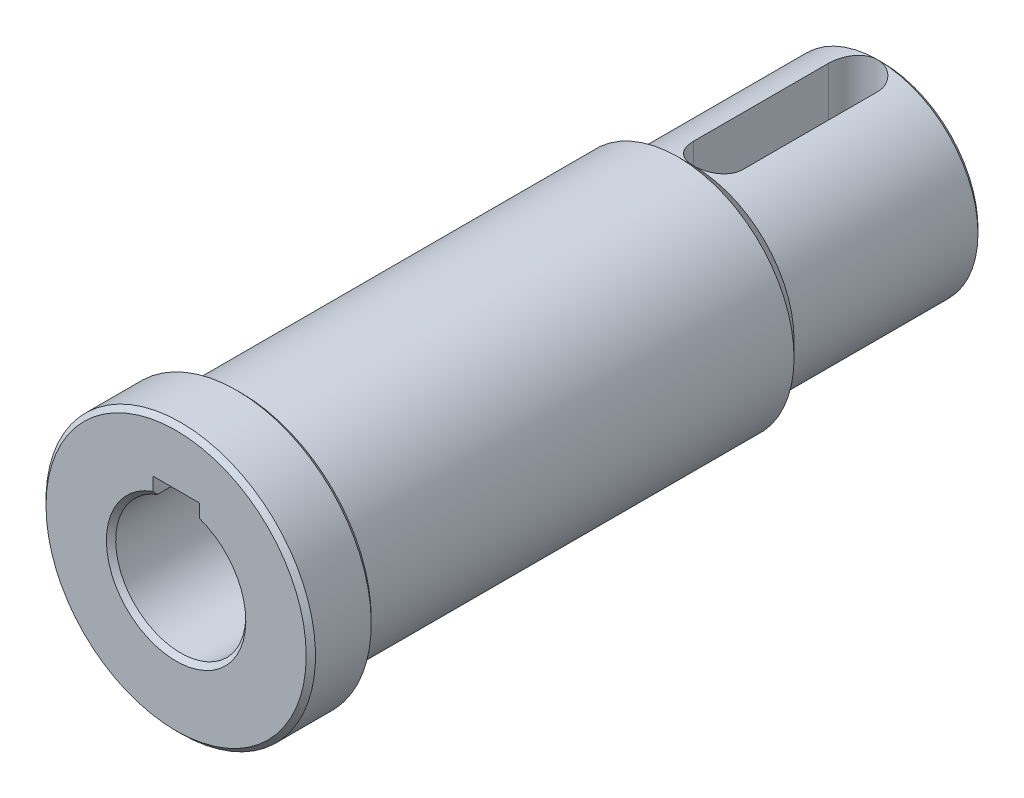
ISO-10303-21;
HEADER;
FILE_DESCRIPTION(('STEP AP214'),'2;1');
FILE_NAME('part.step','',(''),(''),'','','');
FILE_SCHEMA(('AUTOMOTIVE_DESIGN { 1 0 10303 214 1 1 1 1 }'));
ENDSEC;
DATA;
#1=APPLICATION_CONTEXT('core data for automotive mechanical design processes');
#2=APPLICATION_PROTOCOL_DEFINITION('international standard','automotive_design',2000,#1);
#3=PRODUCT_CONTEXT('',#1,'mechanical');
#4=PRODUCT('Part','Part','',(#3));
#5=PRODUCT_RELATED_PRODUCT_CATEGORY('part','',(#4));
#6=PRODUCT_DEFINITION_FORMATION('','',#4);
#7=PRODUCT_DEFINITION_CONTEXT('part definition',#1,'design');
#8=PRODUCT_DEFINITION('design','',#6,#7);
#9=PRODUCT_DEFINITION_SHAPE('','',#8);
#10=(LENGTH_UNIT() NAMED_UNIT(*) SI_UNIT(.MILLI.,.METRE.));
#11=(NAMED_UNIT(*) PLANE_ANGLE_UNIT() SI_UNIT($,.RADIAN.));
#12=(NAMED_UNIT(*) SI_UNIT($,.STERADIAN.) SOLID_ANGLE_UNIT());
#13=UNCERTAINTY_MEASURE_WITH_UNIT(LENGTH_MEASURE(1.E-05),#10,'distance_accuracy_value','');
#14=(GEOMETRIC_REPRESENTATION_CONTEXT(3) GLOBAL_UNCERTAINTY_ASSIGNED_CONTEXT((#13)) GLOBAL_UNIT_ASSIGNED_CONTEXT((#10,
#11,#12)) REPRESENTATION_CONTEXT('',''));
#15=CARTESIAN_POINT('',(0.,0.,0.));
#16=DIRECTION('',(0.,0.,1.));
#17=DIRECTION('',(1.,0.,0.));
#18=AXIS2_PLACEMENT_3D('',#15,#16,#17);
#19=CARTESIAN_POINT('',(0.,0.,-76.));
#20=DIRECTION('',(0.,0.,-1.));
#21=DIRECTION('',(0.,1.,0.));
#22=AXIS2_PLACEMENT_3D('',#19,#20,#21);
#23=CYLINDRICAL_SURFACE('',#22,10.7957682655701);
#24=CARTESIAN_POINT('',(0.,0.,-75.5));
#25=DIRECTION('',(0.,0.,-1.));
#26=DIRECTION('',(0.,1.,0.));
#27=AXIS2_PLACEMENT_3D('',#24,#25,#26);
#28=CIRCLE('',#27,10.7957682655701);
#29=CARTESIAN_POINT('',(0.,10.7957682655701,-75.5));
#30=VERTEX_POINT('',#29);
#31=EDGE_CURVE('E254',#30,#30,#28,.F.);
#32=ORIENTED_EDGE('',*,*,#31,.T.);
#33=CARTESIAN_POINT('',(0.,10.7957682655701,-75.5));
#34=CARTESIAN_POINT('',(0.073310585195216,10.7957753763884,-75.5000083553895));
#35=CARTESIAN_POINT('',(0.146616393612853,10.795021682089,-75.4969555491655));
#36=CARTESIAN_POINT('',(0.292682905196105,10.7920454163856,-75.4847924242007));
#37=CARTESIAN_POINT('',(0.365443689448768,10.7898230680567,-75.4756830253998));
#38=CARTESIAN_POINT('',(0.509768423905785,10.7839678271775,-75.451494745393));
#39=CARTESIAN_POINT('',(0.581334404770962,10.780337652557,-75.4364273654893));
#40=CARTESIAN_POINT('',(0.722886017791657,10.771772658623,-75.4004616351272));
#41=CARTESIAN_POINT('',(0.792871634519733,10.7668378265795,-75.3795632277732));
#42=CARTESIAN_POINT('',(0.999725110573642,10.750265640935,-75.3083440191774));
#43=CARTESIAN_POINT('',(1.13362094377824,10.7368549123223,-75.2494770226933));
#44=CARTESIAN_POINT('',(1.38959223041372,10.7067419195169,-75.1107784251808));
#45=CARTESIAN_POINT('',(1.51166476165192,10.6900388446834,-75.0309416593673));
#46=CARTESIAN_POINT('',(1.74299497514868,10.6547882579527,-74.8508919747348));
#47=CARTESIAN_POINT('',(1.85198806995804,10.6362133675096,-74.7503439012855));
#48=CARTESIAN_POINT('',(2.05175215223605,10.5994938750918,-74.532431364114));
#49=CARTESIAN_POINT('',(2.1425191515432,10.5813493680563,-74.4150632295004));
#50=CARTESIAN_POINT('',(2.3045111735322,10.5472656629175,-74.1647706052295));
#51=CARTESIAN_POINT('',(2.37543356867805,10.5313622794797,-74.0316451236337));
#52=CARTESIAN_POINT('',(2.49374926606229,10.503977229487,-73.7549458735582));
#53=CARTESIAN_POINT('',(2.54116134990427,10.4924920350385,-73.6113805506019));
#54=CARTESIAN_POINT('',(2.59986888778967,10.478067794301,-73.3645560054435));
#55=CARTESIAN_POINT('',(2.61784663440887,10.473574232237,-73.2629274209448));
#56=CARTESIAN_POINT('',(2.64186173392699,10.467531703471,-73.0582559890871));
#57=CARTESIAN_POINT('',(2.64790730753947,10.4659807095046,-72.9552141647026));
#58=CARTESIAN_POINT('',(2.64788413278507,10.4660079334594,-72.8521158672149));
#59=B_SPLINE_CURVE_WITH_KNOTS('',3,(#33,#34,#35,#36,#37,#38,#39,#40,#41,#42,#43,#44,#45,#46,#47,
#48,#49,#50,#51,#52,#53,#54,#55,#56,#57,#58),.UNSPECIFIED.,.F.,.F.,(4,2,2,2,2,2,2,2,2,2,2,2,4),
(0.,0.219856070514305,0.439678754567684,0.65907914787509,0.878481682033997,1.31689178187509,
1.75540996209799,2.20167764167716,2.64804286561239,3.10088411148337,3.55336301242317,
3.86257637519797,4.17157662984683),.UNSPECIFIED.);
#60=CARTESIAN_POINT('',(2.64788413278507,10.4660079334594,-72.8521158672149));
#61=VERTEX_POINT('',#60);
#62=EDGE_CURVE('E189',#30,#61,#59,.T.);
#63=ORIENTED_EDGE('',*,*,#62,.T.);
#64=DIRECTION('',(0.,0.,-1.));
#65=VECTOR('',#64,1.);
#66=CARTESIAN_POINT('',(2.64788413278507,10.4660079334594,-76.));
#67=LINE('',#66,#65);
#68=CARTESIAN_POINT('',(2.64788413278507,10.4660079334594,-58.3521158672149));
#69=VERTEX_POINT('',#68);
#70=EDGE_CURVE('E48',#61,#69,#67,.F.);
#71=ORIENTED_EDGE('',*,*,#70,.T.);
#72=CARTESIAN_POINT('',(2.64788413278507,10.4660079334594,-58.3521158672149));
#73=CARTESIAN_POINT('',(2.64789256768243,10.4659999266148,-58.2788388442181));
#74=CARTESIAN_POINT('',(2.64484247661235,10.4667773204953,-58.2055667863288));
#75=CARTESIAN_POINT('',(2.63269074266503,10.469843536375,-58.0595696897319));
#76=CARTESIAN_POINT('',(2.62359009027542,10.4721321109909,-57.9868445634609));
#77=CARTESIAN_POINT('',(2.59942678526044,10.4781553459011,-57.8425979055177));
#78=CARTESIAN_POINT('',(2.5843760452606,10.4818871164609,-57.7710742648312));
#79=CARTESIAN_POINT('',(2.54845164042408,10.4906790052037,-57.6296079032686));
#80=CARTESIAN_POINT('',(2.52757790183642,10.495739140211,-57.5596652024279));
#81=CARTESIAN_POINT('',(2.45644817055962,10.5127010872924,-57.3529469000733));
#82=CARTESIAN_POINT('',(2.39766013997531,10.5263906800259,-57.2191419364414));
#83=CARTESIAN_POINT('',(2.25914621293891,10.5569820185882,-56.9633213436974));
#84=CARTESIAN_POINT('',(2.17941443993012,10.5738846655921,-56.8413090366247));
#85=CARTESIAN_POINT('',(1.99947282079071,10.6093953751814,-56.6099133535011));
#86=CARTESIAN_POINT('',(1.89890411388456,10.6280296510205,-56.5008125505912));
#87=CARTESIAN_POINT('',(1.68090558787805,10.6646783094102,-56.3008400335947));
#88=CARTESIAN_POINT('',(1.5634725806294,10.6826925739492,-56.2099717741228));
#89=CARTESIAN_POINT('',(1.31311810200829,10.7163653089524,-56.0478691008687));
#90=CARTESIAN_POINT('',(1.18000692083996,10.7319882263235,-55.9769199308348));
#91=CARTESIAN_POINT('',(0.903335634742001,10.7588036076292,-55.8585496025924));
#92=CARTESIAN_POINT('',(0.759783622930865,10.7699994607321,-55.8111104390688));
#93=CARTESIAN_POINT('',(0.512885489228433,10.7840466801174,-55.7523307536069));
#94=CARTESIAN_POINT('',(0.411163829327253,10.7884168052519,-55.7343207528878));
#95=CARTESIAN_POINT('',(0.206312550461609,10.7942885979937,-55.7102641864596));
#96=CARTESIAN_POINT('',(0.10318403360299,10.7957923941529,-55.7042087431093));
#97=CARTESIAN_POINT('',(0.,10.7957682655701,-55.7042317344299));
#98=B_SPLINE_CURVE_WITH_KNOTS('',3,(#72,#73,#74,#75,#76,#77,#78,#79,#80,#81,#82,#83,#84,#85,#86,
#87,#88,#89,#90,#91,#92,#93,#94,#95,#96,#97),.UNSPECIFIED.,.F.,.F.,(4,2,2,2,2,2,2,2,2,2,2,2,4),
(0.,0.219754920386555,0.439473875357049,0.658755142510589,0.878039187089224,1.31618878366007,
1.75446145118829,2.20102515648382,2.64767339479094,3.10042466152438,3.55282864737644,
3.86231782006407,4.17157707466823),.UNSPECIFIED.);
#99=CARTESIAN_POINT('',(0.,10.7957682655701,-55.7042317344299));
#100=VERTEX_POINT('',#99);
#101=EDGE_CURVE('E126',#69,#100,#98,.T.);
#102=ORIENTED_EDGE('',*,*,#101,.T.);
#103=CARTESIAN_POINT('',(0.,0.,-55.7042317344299));
#104=DIRECTION('',(0.,0.,1.));
#105=DIRECTION('',(0.,-1.,0.));
#106=AXIS2_PLACEMENT_3D('',#103,#104,#105);
#107=CIRCLE('',#106,10.7957682655701);
#108=EDGE_CURVE('E269',#100,#100,#107,.F.);
#109=ORIENTED_EDGE('',*,*,#108,.T.);
#110=CARTESIAN_POINT('',(0.,10.7957682655701,-55.7042317344299));
#111=CARTESIAN_POINT('',(-0.0733105851952149,10.7957753763884,-55.7042233790404));
#112=CARTESIAN_POINT('',(-0.146616393612851,10.795021682089,-55.7072761852644));
#113=CARTESIAN_POINT('',(-0.292682905196105,10.7920454163856,-55.7194393102292));
#114=CARTESIAN_POINT('',(-0.365443689448769,10.7898230680567,-55.7285487090301));
#115=CARTESIAN_POINT('',(-0.509768423905786,10.7839678271775,-55.7527369890369));
#116=CARTESIAN_POINT('',(-0.581334404770962,10.780337652557,-55.7678043689406));
#117=CARTESIAN_POINT('',(-0.722886017791656,10.771772658623,-55.8037700993026));
#118=CARTESIAN_POINT('',(-0.792871634519733,10.7668378265795,-55.8246685066566));
#119=CARTESIAN_POINT('',(-0.999725110573645,10.750265640935,-55.8958877152524));
#120=CARTESIAN_POINT('',(-1.13362094377824,10.7368549123223,-55.9547547117365));
#121=CARTESIAN_POINT('',(-1.38959223041372,10.7067419195169,-56.093453309249));
#122=CARTESIAN_POINT('',(-1.51166476165191,10.6900388446834,-56.1732900750626));
#123=CARTESIAN_POINT('',(-1.74299497514868,10.6547882579527,-56.3533397596951));
#124=CARTESIAN_POINT('',(-1.85198806995804,10.6362133675096,-56.4538878331444));
#125=CARTESIAN_POINT('',(-2.05175215223605,10.5994938750918,-56.6718003703159));
#126=CARTESIAN_POINT('',(-2.14251915154321,10.5813493680563,-56.7891685049294));
#127=CARTESIAN_POINT('',(-2.3045111735322,10.5472656629175,-57.0394611292004));
#128=CARTESIAN_POINT('',(-2.37543356867805,10.5313622794797,-57.1725866107961));
#129=CARTESIAN_POINT('',(-2.49374926606229,10.503977229487,-57.4492858608716));
#130=CARTESIAN_POINT('',(-2.54116134990427,10.4924920350385,-57.592851183828));
#131=CARTESIAN_POINT('',(-2.59986888778967,10.478067794301,-57.8396757289863));
#132=CARTESIAN_POINT('',(-2.61784663440887,10.473574232237,-57.941304313485));
#133=CARTESIAN_POINT('',(-2.64186173392699,10.467531703471,-58.1459757453427));
#134=CARTESIAN_POINT('',(-2.64790730753947,10.4659807095046,-58.2490175697272));
#135=CARTESIAN_POINT('',(-2.64788413278507,10.4660079334594,-58.3521158672149));
#136=B_SPLINE_CURVE_WITH_KNOTS('',3,(#110,#111,#112,#113,#114,#115,#116,#117,#118,#119,#120,
#121,#122,#123,#124,#125,#126,#127,#128,#129,#130,#131,#132,#133,#134,#135),.UNSPECIFIED.,.F.,
.F.,(4,2,2,2,2,2,2,2,2,2,2,2,4),(0.,0.219856070514304,0.439678754567685,0.65907914787509,
0.878481682033994,1.31689178187509,1.75540996209799,2.20167764167715,2.64804286561239,
3.10088411148337,3.55336301242318,3.86257637519797,4.17157662984684),.UNSPECIFIED.);
#137=CARTESIAN_POINT('',(-2.64788413278507,10.4660079334594,-58.3521158672149));
#138=VERTEX_POINT('',#137);
#139=EDGE_CURVE('E157',#100,#138,#136,.T.);
#140=ORIENTED_EDGE('',*,*,#139,.T.);
#141=DIRECTION('',(0.,0.,-1.));
#142=VECTOR('',#141,1.);
#143=CARTESIAN_POINT('',(-2.64788413278507,10.4660079334594,-76.));
#144=LINE('',#143,#142);
#145=CARTESIAN_POINT('',(-2.64788413278507,10.4660079334594,-72.8521158672149));
#146=VERTEX_POINT('',#145);
#147=EDGE_CURVE('E11',#138,#146,#144,.T.);
#148=ORIENTED_EDGE('',*,*,#147,.T.);
#149=CARTESIAN_POINT('',(-2.64788413278507,10.4660079334594,-72.8521158672149));
#150=CARTESIAN_POINT('',(-2.64789256768243,10.4659999266148,-72.9253928902118));
#151=CARTESIAN_POINT('',(-2.64484247661235,10.4667773204953,-72.9986649481011));
#152=CARTESIAN_POINT('',(-2.63269074266502,10.469843536375,-73.144662044698));
#153=CARTESIAN_POINT('',(-2.62359009027542,10.4721321109909,-73.217387170969));
#154=CARTESIAN_POINT('',(-2.59942678526044,10.4781553459011,-73.3616338289122));
#155=CARTESIAN_POINT('',(-2.5843760452606,10.4818871164609,-73.4331574695987));
#156=CARTESIAN_POINT('',(-2.54845164042408,10.4906790052037,-73.5746238311613));
#157=CARTESIAN_POINT('',(-2.52757790183642,10.495739140211,-73.6445665320019));
#158=CARTESIAN_POINT('',(-2.45644817055962,10.5127010872924,-73.8512848343565));
#159=CARTESIAN_POINT('',(-2.39766013997532,10.5263906800259,-73.9850897979885));
#160=CARTESIAN_POINT('',(-2.25914621293892,10.5569820185882,-74.2409103907324));
#161=CARTESIAN_POINT('',(-2.17941443993013,10.5738846655921,-74.3629226978051));
#162=CARTESIAN_POINT('',(-1.99947282079071,10.6093953751814,-74.5943183809287));
#163=CARTESIAN_POINT('',(-1.89890411388456,10.6280296510205,-74.7034191838387));
#164=CARTESIAN_POINT('',(-1.68090558787805,10.6646783094102,-74.9033917008352));
#165=CARTESIAN_POINT('',(-1.5634725806294,10.6826925739492,-74.994259960307));
#166=CARTESIAN_POINT('',(-1.31311810200829,10.7163653089524,-75.1563626335611));
#167=CARTESIAN_POINT('',(-1.18000692083996,10.7319882263235,-75.227311803595));
#168=CARTESIAN_POINT('',(-0.903335634742008,10.7588036076292,-75.3456821318374));
#169=CARTESIAN_POINT('',(-0.759783622930872,10.7699994607321,-75.393121295361));
#170=CARTESIAN_POINT('',(-0.51288548922844,10.7840466801174,-75.4519009808229));
#171=CARTESIAN_POINT('',(-0.41116382932726,10.7884168052519,-75.469910981542));
#172=CARTESIAN_POINT('',(-0.206312550461615,10.7942885979937,-75.4939675479702));
#173=CARTESIAN_POINT('',(-0.103184033602996,10.7957923941529,-75.5000229913206));
#174=CARTESIAN_POINT('',(0.,10.7957682655701,-75.5));
#175=B_SPLINE_CURVE_WITH_KNOTS('',3,(#149,#150,#151,#152,#153,#154,#155,#156,#157,#158,#159,
#160,#161,#162,#163,#164,#165,#166,#167,#168,#169,#170,#171,#172,#173,#174),.UNSPECIFIED.,.F.,
.F.,(4,2,2,2,2,2,2,2,2,2,2,2,4),(0.,0.219754920386548,0.439473875357035,0.658755142510588,
0.878039187089224,1.31618878366005,1.75446145118829,2.20102515648382,2.64767339479093,
3.10042466152437,3.55282864737644,3.86231782006406,4.17157707466823),.UNSPECIFIED.);
#176=EDGE_CURVE('E124',#146,#30,#175,.T.);
#177=ORIENTED_EDGE('',*,*,#176,.T.);
#178=EDGE_LOOP('',(#32,#63,#71,#102,#109,#140,#148,#177));
#179=FACE_BOUND('',#178,.T.);
#180=ADVANCED_FACE('F39',(#179),#23,.T.);
#181=CARTESIAN_POINT('',(0.,0.,0.));
#182=DIRECTION('',(0.,0.,1.));
#183=DIRECTION('',(0.,-1.,0.));
#184=AXIS2_PLACEMENT_3D('',#181,#182,#183);
#185=PLANE('',#184);
#186=DIRECTION('',(0.,1.,0.));
#187=VECTOR('',#186,1.);
#188=CARTESIAN_POINT('',(2.5,8.50000000000001,0.));
#189=LINE('',#188,#187);
#190=CARTESIAN_POINT('',(2.5,7.07106781186547,0.));
#191=VERTEX_POINT('',#190);
#192=CARTESIAN_POINT('',(2.5,8.50000000000001,0.));
#193=VERTEX_POINT('',#192);
#194=EDGE_CURVE('E196',#191,#193,#189,.T.);
#195=ORIENTED_EDGE('',*,*,#194,.F.);
#196=CARTESIAN_POINT('',(0.,0.,0.));
#197=DIRECTION('',(0.,0.,1.));
#198=DIRECTION('',(0.,-1.,0.));
#199=AXIS2_PLACEMENT_3D('',#196,#197,#198);
#200=CIRCLE('',#199,7.49999999999999);
#201=CARTESIAN_POINT('',(-2.5,7.07106781186547,0.));
#202=VERTEX_POINT('',#201);
#203=EDGE_CURVE('E257',#191,#202,#200,.F.);
#204=ORIENTED_EDGE('',*,*,#203,.T.);
#205=DIRECTION('',(0.,-1.,0.));
#206=VECTOR('',#205,1.);
#207=CARTESIAN_POINT('',(-2.5,8.50000000000001,0.));
#208=LINE('',#207,#206);
#209=CARTESIAN_POINT('',(-2.5,8.50000000000001,0.));
#210=VERTEX_POINT('',#209);
#211=EDGE_CURVE('E63',#210,#202,#208,.T.);
#212=ORIENTED_EDGE('',*,*,#211,.F.);
#213=DIRECTION('',(-1.,0.,0.));
#214=VECTOR('',#213,1.);
#215=CARTESIAN_POINT('',(-2.5,8.50000000000001,0.));
#216=LINE('',#215,#214);
#217=EDGE_CURVE('E207',#193,#210,#216,.T.);
#218=ORIENTED_EDGE('',*,*,#217,.F.);
#219=EDGE_LOOP('',(#195,#204,#212,#218));
#220=FACE_BOUND('',#219,.T.);
#221=CARTESIAN_POINT('',(0.,0.,0.));
#222=DIRECTION('',(0.,0.,1.));
#223=DIRECTION('',(0.,-1.,0.));
#224=AXIS2_PLACEMENT_3D('',#221,#222,#223);
#225=CIRCLE('',#224,14.);
#226=CARTESIAN_POINT('',(0.,-14.,0.));
#227=VERTEX_POINT('',#226);
#228=EDGE_CURVE('E260',#227,#227,#225,.T.);
#229=ORIENTED_EDGE('',*,*,#228,.T.);
#230=EDGE_LOOP('',(#229));
#231=FACE_BOUND('',#230,.T.);
#232=ADVANCED_FACE('F323',(#220,#231),#185,.T.);
#233=CARTESIAN_POINT('',(0.,0.,-76.));
#234=DIRECTION('',(0.,0.,-1.));
#235=DIRECTION('',(0.,1.,0.));
#236=AXIS2_PLACEMENT_3D('',#233,#234,#235);
#237=CYLINDRICAL_SURFACE('',#236,14.5);
#238=CARTESIAN_POINT('',(0.,0.,-6.49999999999999));
#239=DIRECTION('',(0.,0.,-1.));
#240=DIRECTION('',(0.,1.,0.));
#241=AXIS2_PLACEMENT_3D('',#238,#239,#240);
#242=CIRCLE('',#241,14.5);
#243=CARTESIAN_POINT('',(0.,14.5,-6.49999999999999));
#244=VERTEX_POINT('',#243);
#245=EDGE_CURVE('E245',#244,#244,#242,.F.);
#246=ORIENTED_EDGE('',*,*,#245,.T.);
#247=EDGE_LOOP('',(#246));
#248=FACE_BOUND('',#247,.T.);
#249=CARTESIAN_POINT('',(0.,0.,-0.500000000000014));
#250=DIRECTION('',(0.,0.,1.));
#251=DIRECTION('',(0.,-1.,0.));
#252=AXIS2_PLACEMENT_3D('',#249,#250,#251);
#253=CIRCLE('',#252,14.5);
#254=CARTESIAN_POINT('',(0.,-14.5,-0.500000000000014));
#255=VERTEX_POINT('',#254);
#256=EDGE_CURVE('E242',#255,#255,#253,.F.);
#257=ORIENTED_EDGE('',*,*,#256,.T.);
#258=EDGE_LOOP('',(#257));
#259=FACE_BOUND('',#258,.T.);
#260=ADVANCED_FACE('F328',(#248,#259),#237,.T.);
#261=CARTESIAN_POINT('',(0.,14.5,-7.));
#262=DIRECTION('',(0.,0.,-1.));
#263=DIRECTION('',(0.,1.,0.));
#264=AXIS2_PLACEMENT_3D('',#261,#262,#263);
#265=PLANE('',#264);
#266=CARTESIAN_POINT('',(0.,0.,-7.));
#267=DIRECTION('',(0.,0.,-1.));
#268=DIRECTION('',(0.,1.,0.));
#269=AXIS2_PLACEMENT_3D('',#266,#267,#268);
#270=CIRCLE('',#269,14.);
#271=CARTESIAN_POINT('',(0.,14.,-7.));
#272=VERTEX_POINT('',#271);
#273=EDGE_CURVE('E239',#272,#272,#270,.T.);
#274=ORIENTED_EDGE('',*,*,#273,.T.);
#275=EDGE_LOOP('',(#274));
#276=FACE_BOUND('',#275,.T.);
#277=CARTESIAN_POINT('',(0.,0.,-6.99999999999999));
#278=DIRECTION('',(0.,0.,-1.));
#279=DIRECTION('',(0.,1.,0.));
#280=AXIS2_PLACEMENT_3D('',#277,#278,#279);
#281=CIRCLE('',#280,12.5);
#282=CARTESIAN_POINT('',(0.,12.5,-6.99999999999999));
#283=VERTEX_POINT('',#282);
#284=EDGE_CURVE('E221',#283,#283,#281,.T.);
#285=ORIENTED_EDGE('',*,*,#284,.F.);
#286=EDGE_LOOP('',(#285));
#287=FACE_BOUND('',#286,.T.);
#288=ADVANCED_FACE('F319',(#276,#287),#265,.T.);
#289=CARTESIAN_POINT('',(0.,0.,-76.));
#290=DIRECTION('',(0.,0.,-1.));
#291=DIRECTION('',(0.,1.,0.));
#292=AXIS2_PLACEMENT_3D('',#289,#290,#291);
#293=CYLINDRICAL_SURFACE('',#292,12.5);
#294=CARTESIAN_POINT('',(0.,0.,-54.));
#295=DIRECTION('',(0.,0.,-1.));
#296=DIRECTION('',(0.,1.,0.));
#297=AXIS2_PLACEMENT_3D('',#294,#295,#296);
#298=CIRCLE('',#297,12.5);
#299=CARTESIAN_POINT('',(0.,12.5,-54.));
#300=VERTEX_POINT('',#299);
#301=EDGE_CURVE('E266',#300,#300,#298,.F.);
#302=ORIENTED_EDGE('',*,*,#301,.T.);
#303=EDGE_LOOP('',(#302));
#304=FACE_BOUND('',#303,.T.);
#305=ORIENTED_EDGE('',*,*,#284,.T.);
#306=EDGE_LOOP('',(#305));
#307=FACE_BOUND('',#306,.T.);
#308=ADVANCED_FACE('F314',(#304,#307),#293,.T.);
#309=CARTESIAN_POINT('',(0.,10.7957682655701,-76.));
#310=DIRECTION('',(0.,0.,-1.));
#311=DIRECTION('',(0.,1.,0.));
#312=AXIS2_PLACEMENT_3D('',#309,#310,#311);
#313=PLANE('',#312);
#314=CARTESIAN_POINT('',(0.,0.,-76.));
#315=DIRECTION('',(0.,0.,-1.));
#316=DIRECTION('',(0.,1.,0.));
#317=AXIS2_PLACEMENT_3D('',#314,#315,#316);
#318=CIRCLE('',#317,3.25);
#319=CARTESIAN_POINT('',(0.,3.24999999999999,-76.));
#320=VERTEX_POINT('',#319);
#321=EDGE_CURVE('E251',#320,#320,#318,.F.);
#322=ORIENTED_EDGE('',*,*,#321,.T.);
#323=EDGE_LOOP('',(#322));
#324=FACE_BOUND('',#323,.T.);
#325=CARTESIAN_POINT('',(0.,0.,-76.));
#326=DIRECTION('',(0.,0.,-1.));
#327=DIRECTION('',(0.,1.,0.));
#328=AXIS2_PLACEMENT_3D('',#325,#326,#327);
#329=CIRCLE('',#328,10.2957682655701);
#330=CARTESIAN_POINT('',(0.,10.2957682655701,-76.));
#331=VERTEX_POINT('',#330);
#332=EDGE_CURVE('E248',#331,#331,#329,.T.);
#333=ORIENTED_EDGE('',*,*,#332,.T.);
#334=EDGE_LOOP('',(#333));
#335=FACE_BOUND('',#334,.T.);
#336=ADVANCED_FACE('F311',(#324,#335),#313,.T.);
#337=CARTESIAN_POINT('',(0.,0.,-76.));
#338=DIRECTION('',(0.,0.,-1.));
#339=DIRECTION('',(0.,1.,0.));
#340=AXIS2_PLACEMENT_3D('',#337,#338,#339);
#341=CYLINDRICAL_SURFACE('',#340,7.);
#342=CARTESIAN_POINT('',(0.,0.,-0.5));
#343=DIRECTION('',(0.,0.,1.));
#344=DIRECTION('',(0.,-1.,0.));
#345=AXIS2_PLACEMENT_3D('',#342,#343,#344);
#346=CIRCLE('',#345,7.);
#347=CARTESIAN_POINT('',(-2.5,6.53834841531101,-0.500000000000001));
#348=VERTEX_POINT('',#347);
#349=CARTESIAN_POINT('',(2.5,6.53834841531101,-0.500000000000001));
#350=VERTEX_POINT('',#349);
#351=EDGE_CURVE('E263',#348,#350,#346,.T.);
#352=ORIENTED_EDGE('',*,*,#351,.T.);
#353=DIRECTION('',(0.,0.,-1.));
#354=VECTOR('',#353,1.);
#355=CARTESIAN_POINT('',(2.5,6.53834841531101,-76.));
#356=LINE('',#355,#354);
#357=CARTESIAN_POINT('',(2.5,6.53834841531101,-30.));
#358=VERTEX_POINT('',#357);
#359=EDGE_CURVE('E218',#350,#358,#356,.T.);
#360=ORIENTED_EDGE('',*,*,#359,.T.);
#361=CARTESIAN_POINT('',(0.,0.,-30.));
#362=DIRECTION('',(0.,0.,1.));
#363=DIRECTION('',(1.,0.,0.));
#364=AXIS2_PLACEMENT_3D('',#361,#362,#363);
#365=CIRCLE('',#364,7.);
#366=CARTESIAN_POINT('',(-2.5,6.53834841531101,-30.));
#367=VERTEX_POINT('',#366);
#368=EDGE_CURVE('E503',#367,#358,#365,.F.);
#369=ORIENTED_EDGE('',*,*,#368,.F.);
#370=DIRECTION('',(0.,0.,-1.));
#371=VECTOR('',#370,1.);
#372=CARTESIAN_POINT('',(-2.5,6.53834841531101,-76.));
#373=LINE('',#372,#371);
#374=EDGE_CURVE('E213',#367,#348,#373,.F.);
#375=ORIENTED_EDGE('',*,*,#374,.T.);
#376=EDGE_LOOP('',(#352,#360,#369,#375));
#377=FACE_BOUND('',#376,.T.);
#378=CARTESIAN_POINT('',(0.,0.,-32.5));
#379=DIRECTION('',(0.,0.,-1.));
#380=DIRECTION('',(0.,1.,0.));
#381=AXIS2_PLACEMENT_3D('',#378,#379,#380);
#382=CIRCLE('',#381,7.);
#383=CARTESIAN_POINT('',(0.,7.,-32.5));
#384=VERTEX_POINT('',#383);
#385=EDGE_CURVE('E224',#384,#384,#382,.T.);
#386=ORIENTED_EDGE('',*,*,#385,.T.);
#387=EDGE_LOOP('',(#386));
#388=FACE_BOUND('',#387,.T.);
#389=ADVANCED_FACE('F308',(#377,#388),#341,.F.);
#390=CARTESIAN_POINT('',(0.,7.,-33.5));
#391=DIRECTION('',(0.,0.,-1.));
#392=DIRECTION('',(0.,1.,0.));
#393=AXIS2_PLACEMENT_3D('',#390,#391,#392);
#394=PLANE('',#393);
#395=CARTESIAN_POINT('',(0.,0.,-33.5));
#396=DIRECTION('',(0.,0.,-1.));
#397=DIRECTION('',(0.,1.,0.));
#398=AXIS2_PLACEMENT_3D('',#395,#396,#397);
#399=CIRCLE('',#398,3.24999999999999);
#400=CARTESIAN_POINT('',(0.,3.24999999999999,-33.5));
#401=VERTEX_POINT('',#400);
#402=EDGE_CURVE('E230',#401,#401,#399,.T.);
#403=ORIENTED_EDGE('',*,*,#402,.T.);
#404=EDGE_LOOP('',(#403));
#405=FACE_BOUND('',#404,.T.);
#406=CARTESIAN_POINT('',(0.,0.,-33.5));
#407=DIRECTION('',(0.,0.,-1.));
#408=DIRECTION('',(0.,1.,0.));
#409=AXIS2_PLACEMENT_3D('',#406,#407,#408);
#410=CIRCLE('',#409,6.);
#411=CARTESIAN_POINT('',(0.,6.,-33.5));
#412=VERTEX_POINT('',#411);
#413=EDGE_CURVE('E227',#412,#412,#410,.F.);
#414=ORIENTED_EDGE('',*,*,#413,.T.);
#415=EDGE_LOOP('',(#414));
#416=FACE_BOUND('',#415,.T.);
#417=ADVANCED_FACE('F304',(#405,#416),#394,.F.);
#418=CARTESIAN_POINT('',(0.,0.,-76.));
#419=DIRECTION('',(0.,0.,-1.));
#420=DIRECTION('',(0.,1.,0.));
#421=AXIS2_PLACEMENT_3D('',#418,#419,#420);
#422=CYLINDRICAL_SURFACE('',#421,2.75);
#423=CARTESIAN_POINT('',(0.,0.,-34.));
#424=DIRECTION('',(0.,0.,-1.));
#425=DIRECTION('',(0.,1.,0.));
#426=AXIS2_PLACEMENT_3D('',#423,#424,#425);
#427=CIRCLE('',#426,2.75);
#428=CARTESIAN_POINT('',(0.,2.75,-34.));
#429=VERTEX_POINT('',#428);
#430=EDGE_CURVE('E236',#429,#429,#427,.F.);
#431=ORIENTED_EDGE('',*,*,#430,.T.);
#432=EDGE_LOOP('',(#431));
#433=FACE_BOUND('',#432,.T.);
#434=CARTESIAN_POINT('',(0.,0.,-75.5));
#435=DIRECTION('',(0.,0.,-1.));
#436=DIRECTION('',(0.,1.,0.));
#437=AXIS2_PLACEMENT_3D('',#434,#435,#436);
#438=CIRCLE('',#437,2.75);
#439=CARTESIAN_POINT('',(0.,2.75,-75.5));
#440=VERTEX_POINT('',#439);
#441=EDGE_CURVE('E233',#440,#440,#438,.T.);
#442=ORIENTED_EDGE('',*,*,#441,.T.);
#443=EDGE_LOOP('',(#442));
#444=FACE_BOUND('',#443,.T.);
#445=ADVANCED_FACE('F300',(#433,#444),#422,.F.);
#446=CARTESIAN_POINT('',(0.,0.,-32.5));
#447=DIRECTION('',(0.,0.,-1.));
#448=DIRECTION('',(0.,1.,0.));
#449=AXIS2_PLACEMENT_3D('',#446,#447,#448);
#450=TOROIDAL_SURFACE('',#449,6.,1.);
#451=ORIENTED_EDGE('',*,*,#413,.F.);
#452=EDGE_LOOP('',(#451));
#453=FACE_BOUND('',#452,.T.);
#454=ORIENTED_EDGE('',*,*,#385,.F.);
#455=EDGE_LOOP('',(#454));
#456=FACE_BOUND('',#455,.T.);
#457=ADVANCED_FACE('F303',(#453,#456),#450,.F.);
#458=CARTESIAN_POINT('',(0.,0.,-33.5));
#459=DIRECTION('',(0.,0.,1.));
#460=DIRECTION('',(0.,-1.,0.));
#461=AXIS2_PLACEMENT_3D('',#458,#459,#460);
#462=CONICAL_SURFACE('',#461,3.24999999999999,0.785398163397441);
#463=ORIENTED_EDGE('',*,*,#430,.F.);
#464=EDGE_LOOP('',(#463));
#465=FACE_BOUND('',#464,.T.);
#466=ORIENTED_EDGE('',*,*,#402,.F.);
#467=EDGE_LOOP('',(#466));
#468=FACE_BOUND('',#467,.T.);
#469=ADVANCED_FACE('F369',(#465,#468),#462,.F.);
#470=CARTESIAN_POINT('',(0.,0.,-6.99999999999999));
#471=DIRECTION('',(0.,0.,1.));
#472=DIRECTION('',(0.,-1.,0.));
#473=AXIS2_PLACEMENT_3D('',#470,#471,#472);
#474=CONICAL_SURFACE('',#473,14.,0.785398163397457);
#475=ORIENTED_EDGE('',*,*,#245,.F.);
#476=EDGE_LOOP('',(#475));
#477=FACE_BOUND('',#476,.T.);
#478=ORIENTED_EDGE('',*,*,#273,.F.);
#479=EDGE_LOOP('',(#478));
#480=FACE_BOUND('',#479,.T.);
#481=ADVANCED_FACE('F346',(#477,#480),#474,.T.);
#482=CARTESIAN_POINT('',(0.,0.,-75.5));
#483=DIRECTION('',(0.,0.,-1.));
#484=DIRECTION('',(0.,1.,0.));
#485=AXIS2_PLACEMENT_3D('',#482,#483,#484);
#486=CONICAL_SURFACE('',#485,2.75,0.785398163397455);
#487=ORIENTED_EDGE('',*,*,#321,.F.);
#488=EDGE_LOOP('',(#487));
#489=FACE_BOUND('',#488,.T.);
#490=ORIENTED_EDGE('',*,*,#441,.F.);
#491=EDGE_LOOP('',(#490));
#492=FACE_BOUND('',#491,.T.);
#493=ADVANCED_FACE('F338',(#489,#492),#486,.F.);
#494=CARTESIAN_POINT('',(0.,0.,-76.));
#495=DIRECTION('',(0.,0.,1.));
#496=DIRECTION('',(0.,-1.,0.));
#497=AXIS2_PLACEMENT_3D('',#494,#495,#496);
#498=CONICAL_SURFACE('',#497,10.2957682655701,0.785398163397448);
#499=ORIENTED_EDGE('',*,*,#31,.F.);
#500=EDGE_LOOP('',(#499));
#501=FACE_BOUND('',#500,.T.);
#502=ORIENTED_EDGE('',*,*,#332,.F.);
#503=EDGE_LOOP('',(#502));
#504=FACE_BOUND('',#503,.T.);
#505=ADVANCED_FACE('F334',(#501,#504),#498,.T.);
#506=CARTESIAN_POINT('',(0.,0.,-0.500000000000014));
#507=DIRECTION('',(0.,0.,-1.));
#508=DIRECTION('',(0.,1.,0.));
#509=AXIS2_PLACEMENT_3D('',#506,#507,#508);
#510=CONICAL_SURFACE('',#509,14.5,0.785398163397452);
#511=ORIENTED_EDGE('',*,*,#228,.F.);
#512=EDGE_LOOP('',(#511));
#513=FACE_BOUND('',#512,.T.);
#514=ORIENTED_EDGE('',*,*,#256,.F.);
#515=EDGE_LOOP('',(#514));
#516=FACE_BOUND('',#515,.T.);
#517=ADVANCED_FACE('F337',(#513,#516),#510,.T.);
#518=CARTESIAN_POINT('',(0.,0.,0.));
#519=DIRECTION('',(0.,0.,1.));
#520=DIRECTION('',(0.,-1.,0.));
#521=AXIS2_PLACEMENT_3D('',#518,#519,#520);
#522=CONICAL_SURFACE('',#521,7.49999999999999,0.785398163397439);
#523=CARTESIAN_POINT('',(2.5,-0.000700000000000483,-4.99999990200009));
#524=CARTESIAN_POINT('',(2.5,0.0762723792798447,-5.00008626691263));
#525=CARTESIAN_POINT('',(2.5,0.153205842355031,-4.99648967974022));
#526=CARTESIAN_POINT('',(2.5,0.30628706128627,-4.98244137699883));
#527=CARTESIAN_POINT('',(2.5,0.382436133336596,-4.97200415469445));
#528=CARTESIAN_POINT('',(2.5,0.532098559582422,-4.9450466221414));
#529=CARTESIAN_POINT('',(2.5,0.60563436210139,-4.92864875422352));
#530=CARTESIAN_POINT('',(2.5,0.751319342234645,-4.89048998973922));
#531=CARTESIAN_POINT('',(2.5,0.823467793807931,-4.86872636326024));
#532=CARTESIAN_POINT('',(2.5,1.05034890719529,-4.79227814983041));
#533=CARTESIAN_POINT('',(2.5,1.20219732114897,-4.7290240412417));
#534=CARTESIAN_POINT('',(2.5,1.498997511013,-4.58797910049131));
#535=CARTESIAN_POINT('',(2.5,1.64393617075314,-4.51016190330118));
#536=CARTESIAN_POINT('',(2.5,1.93231251239912,-4.34251798041392));
#537=CARTESIAN_POINT('',(2.5,2.07558302656319,-4.25240710741218));
#538=CARTESIAN_POINT('',(2.5,2.28696684965333,-4.11215817783658));
#539=CARTESIAN_POINT('',(2.5,2.35681469205753,-4.06458089185717));
#540=CARTESIAN_POINT('',(2.5,2.49551092333378,-3.96799032289659));
#541=CARTESIAN_POINT('',(2.5,2.56435933239234,-3.91897706897958));
#542=CARTESIAN_POINT('',(2.5,2.73795839871566,-3.79309277269867));
#543=CARTESIAN_POINT('',(2.5,2.84211743575173,-3.71540732475287));
#544=CARTESIAN_POINT('',(2.5,3.04877119381408,-3.55784893368111));
#545=CARTESIAN_POINT('',(2.5,3.15126580065337,-3.47797584147493));
#546=CARTESIAN_POINT('',(2.5,3.45676612026105,-3.23576281718783));
#547=CARTESIAN_POINT('',(2.5,3.6577410249898,-3.07086412994483));
#548=CARTESIAN_POINT('',(2.5,4.05626937745671,-2.73642371535792));
#549=CARTESIAN_POINT('',(2.5,4.25381724172405,-2.5668753954121));
#550=CARTESIAN_POINT('',(2.5,4.64622558485508,-2.22475733491288));
#551=CARTESIAN_POINT('',(2.5,4.84108643129625,-2.05218801510425));
#552=CARTESIAN_POINT('',(2.5,5.2072555802808,-1.72421726191224));
#553=CARTESIAN_POINT('',(2.5,5.37876955622698,-1.56904475935145));
#554=CARTESIAN_POINT('',(2.5,5.7206017373677,-1.25737552422612));
#555=CARTESIAN_POINT('',(2.5,5.8909198942024,-1.10087873866454));
#556=CARTESIAN_POINT('',(2.5,6.23010362339559,-0.787324620924213));
#557=CARTESIAN_POINT('',(2.5,6.39897200428228,-0.630270322938234));
#558=CARTESIAN_POINT('',(2.5,6.73592933152207,-0.315348399738304));
#559=CARTESIAN_POINT('',(2.5,6.90401832559306,-0.157480825600555));
#560=CARTESIAN_POINT('',(2.5,7.07181026965514,0.000699999999999609));
#561=B_SPLINE_CURVE_WITH_KNOTS('',3,(#523,#524,#525,#526,#527,#528,#529,#530,#531,#532,#533,
#534,#535,#536,#537,#538,#539,#540,#541,#542,#543,#544,#545,#546,#547,#548,#549,#550,#551,#552,
#553,#554,#555,#556,#557,#558,#559,#560),.UNSPECIFIED.,.F.,.F.,(4,2,2,2,2,2,2,2,2,2,2,2,2,2,2,2,
2,2,4),(0.,0.230768267001492,0.461049178606996,0.686844815580739,0.91275556748972,
1.40491629017477,1.89797679504668,2.40542272310258,2.65894886454963,2.91246987814063,
3.30224741240181,3.69205157503901,4.47183632322531,5.25279057255284,6.03363690769499,
6.72750228134826,7.42139555566873,8.11323312730174,8.80502776662704),.UNSPECIFIED.);
#562=EDGE_CURVE('E278',#350,#191,#561,.T.);
#563=ORIENTED_EDGE('',*,*,#562,.F.);
#564=ORIENTED_EDGE('',*,*,#351,.F.);
#565=CARTESIAN_POINT('',(-2.5,7.07181026965514,0.000699999999999856));
#566=CARTESIAN_POINT('',(-2.5,6.94634361247684,-0.117589225269703));
#567=CARTESIAN_POINT('',(-2.5,6.82070575936902,-0.235697072336422));
#568=CARTESIAN_POINT('',(-2.5,6.569021861137,-0.471479352493826));
#569=CARTESIAN_POINT('',(-2.5,6.4429758121584,-0.589153781469383));
#570=CARTESIAN_POINT('',(-2.5,6.06405476652459,-0.941487772220552));
#571=CARTESIAN_POINT('',(-2.5,5.81047177873426,-1.17538725663542));
#572=CARTESIAN_POINT('',(-2.5,5.30079068737201,-1.64019016086096));
#573=CARTESIAN_POINT('',(-2.5,5.04469387575922,-1.87109499124949));
#574=CARTESIAN_POINT('',(-2.5,4.65765071618342,-2.21415212082511));
#575=CARTESIAN_POINT('',(-2.5,4.52816158651545,-2.32794741443335));
#576=CARTESIAN_POINT('',(-2.5,4.26797487831379,-2.55414683842876));
#577=CARTESIAN_POINT('',(-2.5,4.13727731537565,-2.66655098672582));
#578=CARTESIAN_POINT('',(-2.5,3.85980307696252,-2.90194683977996));
#579=CARTESIAN_POINT('',(-2.5,3.71284992190285,-3.02473107903706));
#580=CARTESIAN_POINT('',(-2.5,3.41649673667534,-3.26736539763655));
#581=CARTESIAN_POINT('',(-2.5,3.26709637933908,-3.38721507922315));
#582=CARTESIAN_POINT('',(-2.5,2.96455820215366,-3.62319678094848));
#583=CARTESIAN_POINT('',(-2.5,2.8114094231624,-3.73931481079884));
#584=CARTESIAN_POINT('',(-2.5,2.50074393680047,-3.96555165001302));
#585=CARTESIAN_POINT('',(-2.5,2.34322842594628,-4.07567207871898));
#586=CARTESIAN_POINT('',(-2.5,2.08627007028296,-4.24465224364862));
#587=CARTESIAN_POINT('',(-2.5,1.98874967131221,-4.30642460900494));
#588=CARTESIAN_POINT('',(-2.5,1.79109789825235,-4.42562136650834));
#589=CARTESIAN_POINT('',(-2.5,1.69096722149278,-4.4830469042172));
#590=CARTESIAN_POINT('',(-2.5,1.48841778665274,-4.59171145126995));
#591=CARTESIAN_POINT('',(-2.5,1.38602413710037,-4.64299681119117));
#592=CARTESIAN_POINT('',(-2.5,1.17776148410732,-4.7380178091996));
#593=CARTESIAN_POINT('',(-2.5,1.07189365700717,-4.78175597197286));
#594=CARTESIAN_POINT('',(-2.5,0.887551594587582,-4.84808747466697));
#595=CARTESIAN_POINT('',(-2.5,0.809968392523929,-4.8731427913682));
#596=CARTESIAN_POINT('',(-2.5,0.653134599959273,-4.91718635946556));
#597=CARTESIAN_POINT('',(-2.5,0.573885212623583,-4.93617883866122));
#598=CARTESIAN_POINT('',(-2.5,0.412601375466642,-4.96743475431439));
#599=CARTESIAN_POINT('',(-2.5,0.330542459335335,-4.97957541701536));
#600=CARTESIAN_POINT('',(-2.5,0.2067754154461,-4.99180166262763));
#601=CARTESIAN_POINT('',(-2.5,0.165347865293003,-4.99487971643204));
#602=CARTESIAN_POINT('',(-2.5,0.082382533271851,-4.99898701041644));
#603=CARTESIAN_POINT('',(-2.5,0.0408447292869753,-5.00001580258263));
#604=CARTESIAN_POINT('',(-2.5,-0.000700000000000654,-4.99999990200009));
#605=B_SPLINE_CURVE_WITH_KNOTS('',3,(#565,#566,#567,#568,#569,#570,#571,#572,#573,#574,#575,
#576,#577,#578,#579,#580,#581,#582,#583,#584,#585,#586,#587,#588,#589,#590,#591,#592,#593,#594,
#595,#596,#597,#598,#599,#600,#601,#602,#603,#604),.UNSPECIFIED.,.F.,.F.,(4,2,2,2,2,2,2,2,2,2,2,
2,2,2,2,2,2,2,2,4),(0.,0.51730834706359,1.03462159316234,2.06955725357604,3.1039862946804,
3.62113567321022,4.13827838691044,4.7127429479246,5.28728494674818,5.86377592271785,
6.44011046751819,6.78634432445848,7.13248661502055,7.47582466655262,7.81904764114419,
8.0634296894938,8.30764094870496,8.55609944317277,8.68067968733811,8.8052871645047),.UNSPECIFIED.);
#606=EDGE_CURVE('E272',#202,#348,#605,.T.);
#607=ORIENTED_EDGE('',*,*,#606,.F.);
#608=ORIENTED_EDGE('',*,*,#203,.F.);
#609=EDGE_LOOP('',(#563,#564,#607,#608));
#610=FACE_BOUND('',#609,.T.);
#611=ADVANCED_FACE('F286',(#610),#522,.F.);
#612=CARTESIAN_POINT('',(0.,0.,-56.));
#613=DIRECTION('',(0.,0.,1.));
#614=DIRECTION('',(0.,-1.,0.));
#615=AXIS2_PLACEMENT_3D('',#612,#613,#614);
#616=CONICAL_SURFACE('',#615,10.5,0.785398163397453);
#617=ORIENTED_EDGE('',*,*,#301,.F.);
#618=EDGE_LOOP('',(#617));
#619=FACE_BOUND('',#618,.T.);
#620=ORIENTED_EDGE('',*,*,#108,.F.);
#621=EDGE_LOOP('',(#620));
#622=FACE_BOUND('',#621,.T.);
#623=ADVANCED_FACE('F42',(#619,#622),#616,.T.);
#624=CARTESIAN_POINT('',(0.,0.,-30.));
#625=DIRECTION('',(0.,0.,1.));
#626=DIRECTION('',(1.,0.,0.));
#627=AXIS2_PLACEMENT_3D('',#624,#625,#626);
#628=PLANE('',#627);
#629=ORIENTED_EDGE('',*,*,#368,.T.);
#630=DIRECTION('',(0.,1.,0.));
#631=VECTOR('',#630,1.);
#632=CARTESIAN_POINT('',(2.5,8.50000000000001,-30.));
#633=LINE('',#632,#631);
#634=CARTESIAN_POINT('',(2.5,8.50000000000001,-30.));
#635=VERTEX_POINT('',#634);
#636=EDGE_CURVE('E197',#358,#635,#633,.T.);
#637=ORIENTED_EDGE('',*,*,#636,.T.);
#638=DIRECTION('',(-1.,0.,0.));
#639=VECTOR('',#638,1.);
#640=CARTESIAN_POINT('',(-2.5,8.50000000000001,-30.));
#641=LINE('',#640,#639);
#642=CARTESIAN_POINT('',(-2.5,8.50000000000001,-30.));
#643=VERTEX_POINT('',#642);
#644=EDGE_CURVE('E199',#635,#643,#641,.T.);
#645=ORIENTED_EDGE('',*,*,#644,.T.);
#646=DIRECTION('',(0.,-1.,0.));
#647=VECTOR('',#646,1.);
#648=CARTESIAN_POINT('',(-2.5,8.50000000000001,-30.));
#649=LINE('',#648,#647);
#650=EDGE_CURVE('E202',#643,#367,#649,.T.);
#651=ORIENTED_EDGE('',*,*,#650,.T.);
#652=EDGE_LOOP('',(#629,#637,#645,#651));
#653=FACE_BOUND('',#652,.T.);
#654=ADVANCED_FACE('F181',(#653),#628,.T.);
#655=CARTESIAN_POINT('',(2.5,8.50000000000001,-30.));
#656=DIRECTION('',(1.,0.,0.));
#657=DIRECTION('',(0.,1.,0.));
#658=AXIS2_PLACEMENT_3D('',#655,#656,#657);
#659=PLANE('',#658);
#660=ORIENTED_EDGE('',*,*,#562,.T.);
#661=ORIENTED_EDGE('',*,*,#194,.T.);
#662=DIRECTION('',(0.,0.,1.));
#663=VECTOR('',#662,1.);
#664=CARTESIAN_POINT('',(2.5,8.50000000000001,-30.));
#665=LINE('',#664,#663);
#666=EDGE_CURVE('E205',#635,#193,#665,.T.);
#667=ORIENTED_EDGE('',*,*,#666,.F.);
#668=ORIENTED_EDGE('',*,*,#636,.F.);
#669=ORIENTED_EDGE('',*,*,#359,.F.);
#670=EDGE_LOOP('',(#660,#661,#667,#668,#669));
#671=FACE_BOUND('',#670,.T.);
#672=ADVANCED_FACE('F293',(#671),#659,.F.);
#673=CARTESIAN_POINT('',(-2.5,8.50000000000001,-30.));
#674=DIRECTION('',(-1.,0.,0.));
#675=DIRECTION('',(0.,-1.,0.));
#676=AXIS2_PLACEMENT_3D('',#673,#674,#675);
#677=PLANE('',#676);
#678=ORIENTED_EDGE('',*,*,#650,.F.);
#679=DIRECTION('',(0.,0.,1.));
#680=VECTOR('',#679,1.);
#681=CARTESIAN_POINT('',(-2.5,8.50000000000001,-30.));
#682=LINE('',#681,#680);
#683=EDGE_CURVE('E211',#643,#210,#682,.T.);
#684=ORIENTED_EDGE('',*,*,#683,.T.);
#685=ORIENTED_EDGE('',*,*,#211,.T.);
#686=ORIENTED_EDGE('',*,*,#606,.T.);
#687=ORIENTED_EDGE('',*,*,#374,.F.);
#688=EDGE_LOOP('',(#678,#684,#685,#686,#687));
#689=FACE_BOUND('',#688,.T.);
#690=ADVANCED_FACE('F289',(#689),#677,.F.);
#691=CARTESIAN_POINT('',(-2.5,8.50000000000001,-30.));
#692=DIRECTION('',(0.,1.,0.));
#693=DIRECTION('',(0.,0.,1.));
#694=AXIS2_PLACEMENT_3D('',#691,#692,#693);
#695=PLANE('',#694);
#696=ORIENTED_EDGE('',*,*,#217,.T.);
#697=ORIENTED_EDGE('',*,*,#683,.F.);
#698=ORIENTED_EDGE('',*,*,#644,.F.);
#699=ORIENTED_EDGE('',*,*,#666,.T.);
#700=EDGE_LOOP('',(#696,#697,#698,#699));
#701=FACE_BOUND('',#700,.T.);
#702=ADVANCED_FACE('F180',(#701),#695,.F.);
#703=CARTESIAN_POINT('',(0.,14.5,-72.8521158672149));
#704=DIRECTION('',(0.,-1.,0.));
#705=DIRECTION('',(0.,0.,-1.));
#706=AXIS2_PLACEMENT_3D('',#703,#704,#705);
#707=CYLINDRICAL_SURFACE('',#706,2.64788413278507);
#708=ORIENTED_EDGE('',*,*,#176,.F.);
#709=DIRECTION('',(0.,-1.,0.));
#710=VECTOR('',#709,1.);
#711=CARTESIAN_POINT('',(-2.64788413278507,14.5,-72.8521158672149));
#712=LINE('',#711,#710);
#713=CARTESIAN_POINT('',(-2.64788413278507,4.5,-72.8521158672149));
#714=VERTEX_POINT('',#713);
#715=EDGE_CURVE('E117',#146,#714,#712,.T.);
#716=ORIENTED_EDGE('',*,*,#715,.T.);
#717=CARTESIAN_POINT('',(0.,4.5,-72.8521158672149));
#718=DIRECTION('',(0.,1.,0.));
#719=DIRECTION('',(0.,0.,1.));
#720=AXIS2_PLACEMENT_3D('',#717,#718,#719);
#721=CIRCLE('',#720,2.64788413278507);
#722=CARTESIAN_POINT('',(2.64788413278507,4.5,-72.8521158672149));
#723=VERTEX_POINT('',#722);
#724=EDGE_CURVE('E122',#723,#714,#721,.T.);
#725=ORIENTED_EDGE('',*,*,#724,.F.);
#726=DIRECTION('',(0.,-1.,0.));
#727=VECTOR('',#726,1.);
#728=CARTESIAN_POINT('',(2.64788413278507,14.5,-72.8521158672149));
#729=LINE('',#728,#727);
#730=EDGE_CURVE('E145',#61,#723,#729,.T.);
#731=ORIENTED_EDGE('',*,*,#730,.F.);
#732=ORIENTED_EDGE('',*,*,#62,.F.);
#733=EDGE_LOOP('',(#708,#716,#725,#731,#732));
#734=FACE_BOUND('',#733,.T.);
#735=ADVANCED_FACE('F119',(#734),#707,.F.);
#736=CARTESIAN_POINT('',(-2.64788413278507,14.5,-72.8521158672149));
#737=DIRECTION('',(1.,0.,0.));
#738=DIRECTION('',(0.,0.,-1.));
#739=AXIS2_PLACEMENT_3D('',#736,#737,#738);
#740=PLANE('',#739);
#741=DIRECTION('',(0.,-1.,0.));
#742=VECTOR('',#741,1.);
#743=CARTESIAN_POINT('',(-2.64788413278507,14.5,-58.3521158672149));
#744=LINE('',#743,#742);
#745=CARTESIAN_POINT('',(-2.64788413278507,4.5,-58.3521158672149));
#746=VERTEX_POINT('',#745);
#747=EDGE_CURVE('E127',#138,#746,#744,.T.);
#748=ORIENTED_EDGE('',*,*,#747,.T.);
#749=DIRECTION('',(0.,0.,1.));
#750=VECTOR('',#749,1.);
#751=CARTESIAN_POINT('',(-2.64788413278507,4.5,-72.8521158672149));
#752=LINE('',#751,#750);
#753=EDGE_CURVE('E130',#714,#746,#752,.T.);
#754=ORIENTED_EDGE('',*,*,#753,.F.);
#755=ORIENTED_EDGE('',*,*,#715,.F.);
#756=ORIENTED_EDGE('',*,*,#147,.F.);
#757=EDGE_LOOP('',(#748,#754,#755,#756));
#758=FACE_BOUND('',#757,.T.);
#759=ADVANCED_FACE('F131',(#758),#740,.T.);
#760=CARTESIAN_POINT('',(0.,14.5,-58.3521158672149));
#761=DIRECTION('',(0.,-1.,0.));
#762=DIRECTION('',(0.,0.,-1.));
#763=AXIS2_PLACEMENT_3D('',#760,#761,#762);
#764=CYLINDRICAL_SURFACE('',#763,2.64788413278507);
#765=ORIENTED_EDGE('',*,*,#101,.F.);
#766=DIRECTION('',(0.,-1.,0.));
#767=VECTOR('',#766,1.);
#768=CARTESIAN_POINT('',(2.64788413278507,14.5,-58.3521158672149));
#769=LINE('',#768,#767);
#770=CARTESIAN_POINT('',(2.64788413278507,4.5,-58.3521158672149));
#771=VERTEX_POINT('',#770);
#772=EDGE_CURVE('E55',#69,#771,#769,.T.);
#773=ORIENTED_EDGE('',*,*,#772,.T.);
#774=CARTESIAN_POINT('',(0.,4.5,-58.3521158672149));
#775=DIRECTION('',(0.,1.,0.));
#776=DIRECTION('',(0.,0.,1.));
#777=AXIS2_PLACEMENT_3D('',#774,#775,#776);
#778=CIRCLE('',#777,2.64788413278507);
#779=EDGE_CURVE('E136',#746,#771,#778,.T.);
#780=ORIENTED_EDGE('',*,*,#779,.F.);
#781=ORIENTED_EDGE('',*,*,#747,.F.);
#782=ORIENTED_EDGE('',*,*,#139,.F.);
#783=EDGE_LOOP('',(#765,#773,#780,#781,#782));
#784=FACE_BOUND('',#783,.T.);
#785=ADVANCED_FACE('F166',(#784),#764,.F.);
#786=CARTESIAN_POINT('',(2.64788413278507,14.5,-72.8521158672149));
#787=DIRECTION('',(-1.,0.,0.));
#788=DIRECTION('',(0.,0.,1.));
#789=AXIS2_PLACEMENT_3D('',#786,#787,#788);
#790=PLANE('',#789);
#791=ORIENTED_EDGE('',*,*,#730,.T.);
#792=DIRECTION('',(0.,0.,-1.));
#793=VECTOR('',#792,1.);
#794=CARTESIAN_POINT('',(2.64788413278507,4.5,-72.8521158672149));
#795=LINE('',#794,#793);
#796=EDGE_CURVE('E140',#771,#723,#795,.T.);
#797=ORIENTED_EDGE('',*,*,#796,.F.);
#798=ORIENTED_EDGE('',*,*,#772,.F.);
#799=ORIENTED_EDGE('',*,*,#70,.F.);
#800=EDGE_LOOP('',(#791,#797,#798,#799));
#801=FACE_BOUND('',#800,.T.);
#802=ADVANCED_FACE('F171',(#801),#790,.T.);
#803=CARTESIAN_POINT('',(0.,4.5,-72.8521158672149));
#804=DIRECTION('',(0.,1.,0.));
#805=DIRECTION('',(0.,0.,1.));
#806=AXIS2_PLACEMENT_3D('',#803,#804,#805);
#807=PLANE('',#806);
#808=ORIENTED_EDGE('',*,*,#724,.T.);
#809=ORIENTED_EDGE('',*,*,#753,.T.);
#810=ORIENTED_EDGE('',*,*,#779,.T.);
#811=ORIENTED_EDGE('',*,*,#796,.T.);
#812=EDGE_LOOP('',(#808,#809,#810,#811));
#813=FACE_BOUND('',#812,.T.);
#814=ADVANCED_FACE('F139',(#813),#807,.T.);
#815=CLOSED_SHELL('',(#180,#232,#260,#288,#308,#336,#389,#417,#445,#457,#469,#481,#493,#505,
#517,#611,#623,#654,#672,#690,#702,#735,#759,#785,#802,#814));
#816=MANIFOLD_SOLID_BREP('B2',#815);
#817=ADVANCED_BREP_SHAPE_REPRESENTATION('',(#18,#816),#14);
#818=SHAPE_DEFINITION_REPRESENTATION(#9,#817);
ENDSEC;
END-ISO-10303-21;
